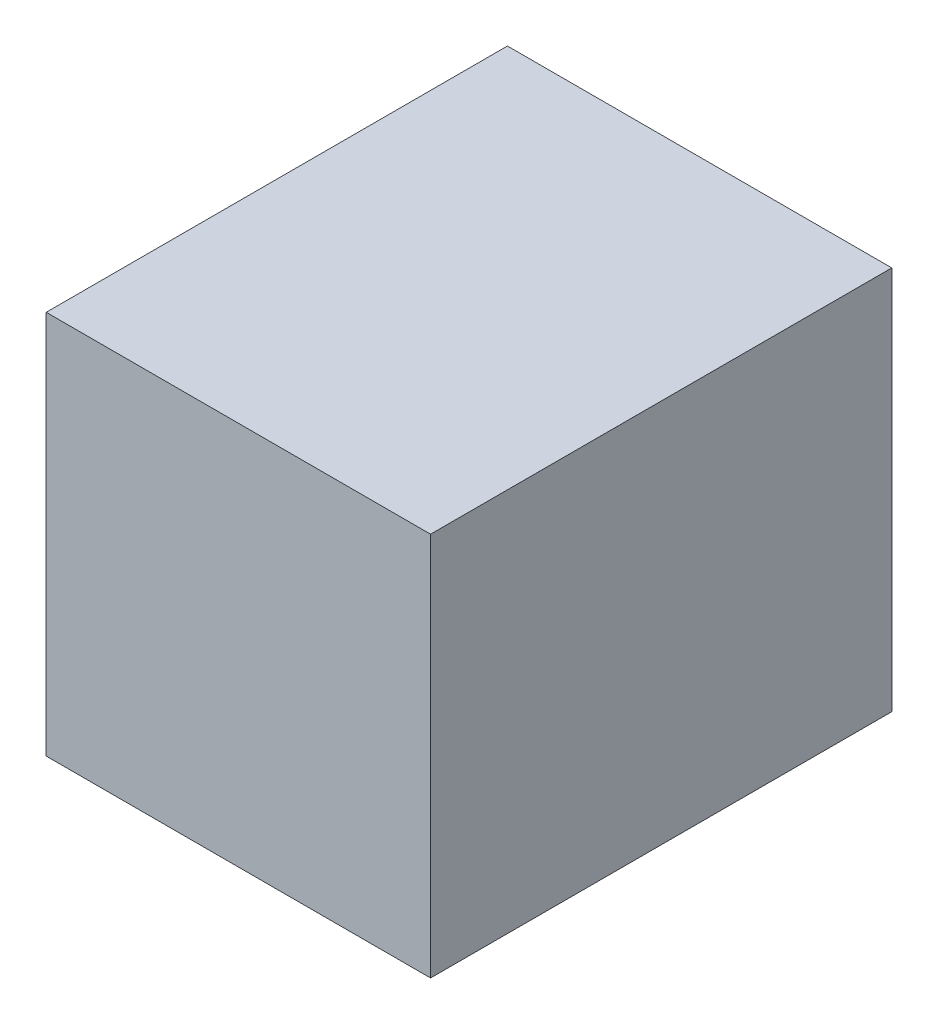
ISO-10303-21;
HEADER;
FILE_DESCRIPTION(('STEP AP214'),'2;1');
FILE_NAME('part.step','',(''),(''),'','','');
FILE_SCHEMA(('AUTOMOTIVE_DESIGN { 1 0 10303 214 1 1 1 1 }'));
ENDSEC;
DATA;
#1=APPLICATION_CONTEXT('core data for automotive mechanical design processes');
#2=APPLICATION_PROTOCOL_DEFINITION('international standard','automotive_design',2000,#1);
#3=PRODUCT_CONTEXT('',#1,'mechanical');
#4=PRODUCT('Part','Part','',(#3));
#5=PRODUCT_RELATED_PRODUCT_CATEGORY('part','',(#4));
#6=PRODUCT_DEFINITION_FORMATION('','',#4);
#7=PRODUCT_DEFINITION_CONTEXT('part definition',#1,'design');
#8=PRODUCT_DEFINITION('design','',#6,#7);
#9=PRODUCT_DEFINITION_SHAPE('','',#8);
#10=(LENGTH_UNIT() NAMED_UNIT(*) SI_UNIT(.MILLI.,.METRE.));
#11=(NAMED_UNIT(*) PLANE_ANGLE_UNIT() SI_UNIT($,.RADIAN.));
#12=(NAMED_UNIT(*) SI_UNIT($,.STERADIAN.) SOLID_ANGLE_UNIT());
#13=UNCERTAINTY_MEASURE_WITH_UNIT(LENGTH_MEASURE(1.E-05),#10,'distance_accuracy_value','');
#14=(GEOMETRIC_REPRESENTATION_CONTEXT(3) GLOBAL_UNCERTAINTY_ASSIGNED_CONTEXT((#13)) GLOBAL_UNIT_ASSIGNED_CONTEXT((#10,
#11,#12)) REPRESENTATION_CONTEXT('',''));
#15=CARTESIAN_POINT('',(0.,0.,0.));
#16=DIRECTION('',(0.,0.,1.));
#17=DIRECTION('',(1.,0.,0.));
#18=AXIS2_PLACEMENT_3D('',#15,#16,#17);
#19=CARTESIAN_POINT('',(254.,508.,-304.8));
#20=DIRECTION('',(-1.,0.,0.));
#21=DIRECTION('',(0.,0.,1.));
#22=AXIS2_PLACEMENT_3D('',#19,#20,#21);
#23=PLANE('',#22);
#24=DIRECTION('',(0.,0.,-1.));
#25=VECTOR('',#24,1.);
#26=CARTESIAN_POINT('',(254.,0.,-304.8));
#27=LINE('',#26,#25);
#28=CARTESIAN_POINT('',(254.,0.,304.8));
#29=VERTEX_POINT('',#28);
#30=CARTESIAN_POINT('',(254.,0.,-304.8));
#31=VERTEX_POINT('',#30);
#32=EDGE_CURVE('E104',#29,#31,#27,.T.);
#33=ORIENTED_EDGE('',*,*,#32,.T.);
#34=DIRECTION('',(0.,-1.,0.));
#35=VECTOR('',#34,1.);
#36=CARTESIAN_POINT('',(254.,508.,-304.8));
#37=LINE('',#36,#35);
#38=CARTESIAN_POINT('',(254.,508.,-304.8));
#39=VERTEX_POINT('',#38);
#40=EDGE_CURVE('E11',#39,#31,#37,.T.);
#41=ORIENTED_EDGE('',*,*,#40,.F.);
#42=DIRECTION('',(0.,0.,-1.));
#43=VECTOR('',#42,1.);
#44=CARTESIAN_POINT('',(254.,508.,-304.8));
#45=LINE('',#44,#43);
#46=CARTESIAN_POINT('',(254.,508.,304.8));
#47=VERTEX_POINT('',#46);
#48=EDGE_CURVE('E92',#47,#39,#45,.T.);
#49=ORIENTED_EDGE('',*,*,#48,.F.);
#50=DIRECTION('',(0.,-1.,0.));
#51=VECTOR('',#50,1.);
#52=CARTESIAN_POINT('',(254.,508.,304.8));
#53=LINE('',#52,#51);
#54=EDGE_CURVE('E100',#47,#29,#53,.T.);
#55=ORIENTED_EDGE('',*,*,#54,.T.);
#56=EDGE_LOOP('',(#33,#41,#49,#55));
#57=FACE_BOUND('',#56,.T.);
#58=ADVANCED_FACE('F41',(#57),#23,.F.);
#59=CARTESIAN_POINT('',(-254.,508.,-304.8));
#60=DIRECTION('',(0.,0.,1.));
#61=DIRECTION('',(1.,0.,0.));
#62=AXIS2_PLACEMENT_3D('',#59,#60,#61);
#63=PLANE('',#62);
#64=DIRECTION('',(-1.,0.,0.));
#65=VECTOR('',#64,1.);
#66=CARTESIAN_POINT('',(-254.,0.,-304.8));
#67=LINE('',#66,#65);
#68=CARTESIAN_POINT('',(-254.,0.,-304.8));
#69=VERTEX_POINT('',#68);
#70=EDGE_CURVE('E96',#31,#69,#67,.T.);
#71=ORIENTED_EDGE('',*,*,#70,.T.);
#72=DIRECTION('',(0.,-1.,0.));
#73=VECTOR('',#72,1.);
#74=CARTESIAN_POINT('',(-254.,508.,-304.8));
#75=LINE('',#74,#73);
#76=CARTESIAN_POINT('',(-254.,508.,-304.8));
#77=VERTEX_POINT('',#76);
#78=EDGE_CURVE('E49',#77,#69,#75,.T.);
#79=ORIENTED_EDGE('',*,*,#78,.F.);
#80=DIRECTION('',(-1.,0.,0.));
#81=VECTOR('',#80,1.);
#82=CARTESIAN_POINT('',(-254.,508.,-304.8));
#83=LINE('',#82,#81);
#84=EDGE_CURVE('E87',#39,#77,#83,.T.);
#85=ORIENTED_EDGE('',*,*,#84,.F.);
#86=ORIENTED_EDGE('',*,*,#40,.T.);
#87=EDGE_LOOP('',(#71,#79,#85,#86));
#88=FACE_BOUND('',#87,.T.);
#89=ADVANCED_FACE('F95',(#88),#63,.F.);
#90=CARTESIAN_POINT('',(-254.,508.,-304.8));
#91=DIRECTION('',(1.,0.,0.));
#92=DIRECTION('',(0.,0.,-1.));
#93=AXIS2_PLACEMENT_3D('',#90,#91,#92);
#94=PLANE('',#93);
#95=DIRECTION('',(0.,0.,1.));
#96=VECTOR('',#95,1.);
#97=CARTESIAN_POINT('',(-254.,0.,-304.8));
#98=LINE('',#97,#96);
#99=CARTESIAN_POINT('',(-254.,0.,304.8));
#100=VERTEX_POINT('',#99);
#101=EDGE_CURVE('E74',#69,#100,#98,.T.);
#102=ORIENTED_EDGE('',*,*,#101,.T.);
#103=DIRECTION('',(0.,-1.,0.));
#104=VECTOR('',#103,1.);
#105=CARTESIAN_POINT('',(-254.,508.,304.8));
#106=LINE('',#105,#104);
#107=CARTESIAN_POINT('',(-254.,508.,304.8));
#108=VERTEX_POINT('',#107);
#109=EDGE_CURVE('E97',#108,#100,#106,.T.);
#110=ORIENTED_EDGE('',*,*,#109,.F.);
#111=DIRECTION('',(0.,0.,1.));
#112=VECTOR('',#111,1.);
#113=CARTESIAN_POINT('',(-254.,508.,-304.8));
#114=LINE('',#113,#112);
#115=EDGE_CURVE('E90',#77,#108,#114,.T.);
#116=ORIENTED_EDGE('',*,*,#115,.F.);
#117=ORIENTED_EDGE('',*,*,#78,.T.);
#118=EDGE_LOOP('',(#102,#110,#116,#117));
#119=FACE_BOUND('',#118,.T.);
#120=ADVANCED_FACE('F98',(#119),#94,.F.);
#121=CARTESIAN_POINT('',(-254.,508.,304.8));
#122=DIRECTION('',(0.,0.,-1.));
#123=DIRECTION('',(-1.,0.,0.));
#124=AXIS2_PLACEMENT_3D('',#121,#122,#123);
#125=PLANE('',#124);
#126=DIRECTION('',(1.,0.,0.));
#127=VECTOR('',#126,1.);
#128=CARTESIAN_POINT('',(-254.,0.,304.8));
#129=LINE('',#128,#127);
#130=EDGE_CURVE('E80',#100,#29,#129,.T.);
#131=ORIENTED_EDGE('',*,*,#130,.T.);
#132=ORIENTED_EDGE('',*,*,#54,.F.);
#133=DIRECTION('',(1.,0.,0.));
#134=VECTOR('',#133,1.);
#135=CARTESIAN_POINT('',(-254.,508.,304.8));
#136=LINE('',#135,#134);
#137=EDGE_CURVE('E57',#108,#47,#136,.T.);
#138=ORIENTED_EDGE('',*,*,#137,.F.);
#139=ORIENTED_EDGE('',*,*,#109,.T.);
#140=EDGE_LOOP('',(#131,#132,#138,#139));
#141=FACE_BOUND('',#140,.T.);
#142=ADVANCED_FACE('F111',(#141),#125,.F.);
#143=CARTESIAN_POINT('',(0.,508.,0.));
#144=DIRECTION('',(0.,1.,0.));
#145=DIRECTION('',(0.,0.,1.));
#146=AXIS2_PLACEMENT_3D('',#143,#144,#145);
#147=PLANE('',#146);
#148=ORIENTED_EDGE('',*,*,#48,.T.);
#149=ORIENTED_EDGE('',*,*,#84,.T.);
#150=ORIENTED_EDGE('',*,*,#115,.T.);
#151=ORIENTED_EDGE('',*,*,#137,.T.);
#152=EDGE_LOOP('',(#148,#149,#150,#151));
#153=FACE_BOUND('',#152,.T.);
#154=ADVANCED_FACE('F88',(#153),#147,.T.);
#155=CARTESIAN_POINT('',(0.,0.,0.));
#156=DIRECTION('',(0.,1.,0.));
#157=DIRECTION('',(0.,0.,1.));
#158=AXIS2_PLACEMENT_3D('',#155,#156,#157);
#159=PLANE('',#158);
#160=ORIENTED_EDGE('',*,*,#32,.F.);
#161=ORIENTED_EDGE('',*,*,#130,.F.);
#162=ORIENTED_EDGE('',*,*,#101,.F.);
#163=ORIENTED_EDGE('',*,*,#70,.F.);
#164=EDGE_LOOP('',(#160,#161,#162,#163));
#165=FACE_BOUND('',#164,.T.);
#166=ADVANCED_FACE('F114',(#165),#159,.F.);
#167=CLOSED_SHELL('',(#58,#89,#120,#142,#154,#166));
#168=MANIFOLD_SOLID_BREP('B2',#167);
#169=ADVANCED_BREP_SHAPE_REPRESENTATION('',(#18,#168),#14);
#170=SHAPE_DEFINITION_REPRESENTATION(#9,#169);
ENDSEC;
END-ISO-10303-21;
